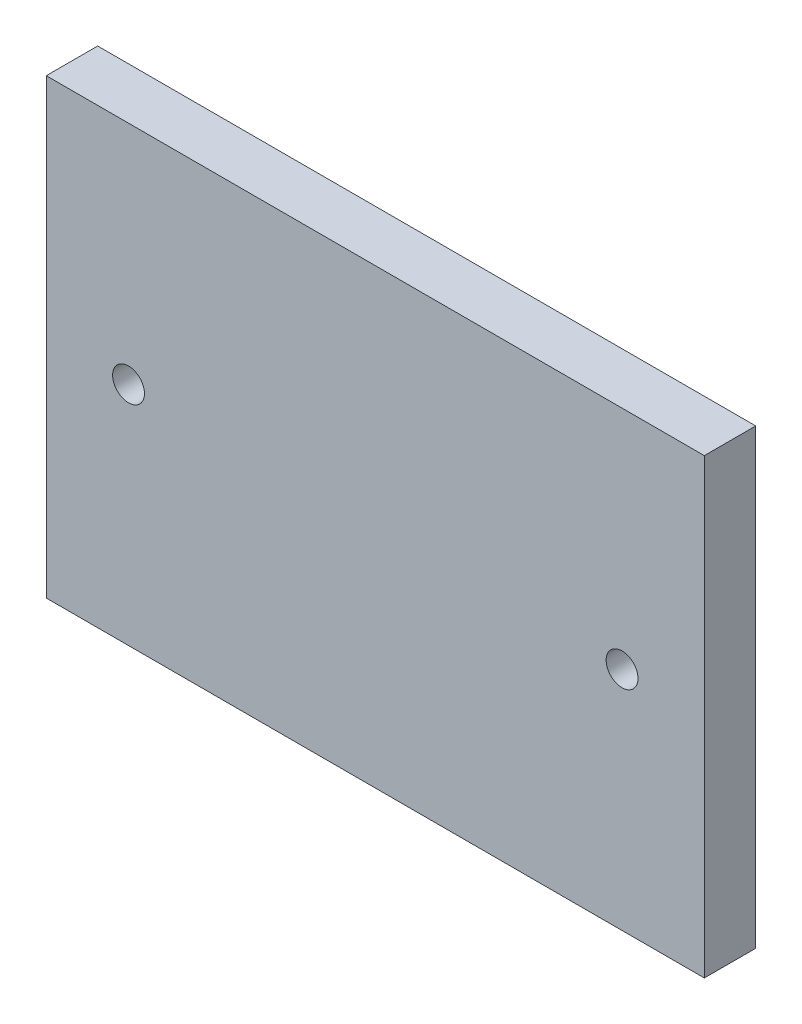
ISO-10303-21;
HEADER;
FILE_DESCRIPTION(('STEP AP214'),'2;1');
FILE_NAME('part.step','',(''),(''),'','','');
FILE_SCHEMA(('AUTOMOTIVE_DESIGN { 1 0 10303 214 1 1 1 1 }'));
ENDSEC;
DATA;
#1=APPLICATION_CONTEXT('core data for automotive mechanical design processes');
#2=APPLICATION_PROTOCOL_DEFINITION('international standard','automotive_design',2000,#1);
#3=PRODUCT_CONTEXT('',#1,'mechanical');
#4=PRODUCT('Part','Part','',(#3));
#5=PRODUCT_RELATED_PRODUCT_CATEGORY('part','',(#4));
#6=PRODUCT_DEFINITION_FORMATION('','',#4);
#7=PRODUCT_DEFINITION_CONTEXT('part definition',#1,'design');
#8=PRODUCT_DEFINITION('design','',#6,#7);
#9=PRODUCT_DEFINITION_SHAPE('','',#8);
#10=(LENGTH_UNIT() NAMED_UNIT(*) SI_UNIT(.MILLI.,.METRE.));
#11=(NAMED_UNIT(*) PLANE_ANGLE_UNIT() SI_UNIT($,.RADIAN.));
#12=(NAMED_UNIT(*) SI_UNIT($,.STERADIAN.) SOLID_ANGLE_UNIT());
#13=UNCERTAINTY_MEASURE_WITH_UNIT(LENGTH_MEASURE(1.E-05),#10,'distance_accuracy_value','');
#14=(GEOMETRIC_REPRESENTATION_CONTEXT(3) GLOBAL_UNCERTAINTY_ASSIGNED_CONTEXT((#13)) GLOBAL_UNIT_ASSIGNED_CONTEXT((#10,
#11,#12)) REPRESENTATION_CONTEXT('',''));
#15=CARTESIAN_POINT('',(0.,0.,0.));
#16=DIRECTION('',(0.,0.,1.));
#17=DIRECTION('',(1.,0.,0.));
#18=AXIS2_PLACEMENT_3D('',#15,#16,#17);
#19=CARTESIAN_POINT('',(32.,-22.,32.));
#20=DIRECTION('',(-1.,0.,0.));
#21=DIRECTION('',(0.,0.,1.));
#22=AXIS2_PLACEMENT_3D('',#19,#20,#21);
#23=PLANE('',#22);
#24=DIRECTION('',(0.,1.,0.));
#25=VECTOR('',#24,1.);
#26=CARTESIAN_POINT('',(32.,-22.,27.));
#27=LINE('',#26,#25);
#28=CARTESIAN_POINT('',(32.,-22.,27.));
#29=VERTEX_POINT('',#28);
#30=CARTESIAN_POINT('',(32.,22.,27.));
#31=VERTEX_POINT('',#30);
#32=EDGE_CURVE('E98',#29,#31,#27,.T.);
#33=ORIENTED_EDGE('',*,*,#32,.T.);
#34=DIRECTION('',(0.,0.,-1.));
#35=VECTOR('',#34,1.);
#36=CARTESIAN_POINT('',(32.,22.,32.));
#37=LINE('',#36,#35);
#38=CARTESIAN_POINT('',(32.,22.,32.));
#39=VERTEX_POINT('',#38);
#40=EDGE_CURVE('E11',#39,#31,#37,.T.);
#41=ORIENTED_EDGE('',*,*,#40,.F.);
#42=DIRECTION('',(0.,1.,0.));
#43=VECTOR('',#42,1.);
#44=CARTESIAN_POINT('',(32.,-22.,32.));
#45=LINE('',#44,#43);
#46=CARTESIAN_POINT('',(32.,-22.,32.));
#47=VERTEX_POINT('',#46);
#48=EDGE_CURVE('E86',#47,#39,#45,.T.);
#49=ORIENTED_EDGE('',*,*,#48,.F.);
#50=DIRECTION('',(0.,0.,-1.));
#51=VECTOR('',#50,1.);
#52=CARTESIAN_POINT('',(32.,-22.,32.));
#53=LINE('',#52,#51);
#54=EDGE_CURVE('E94',#47,#29,#53,.T.);
#55=ORIENTED_EDGE('',*,*,#54,.T.);
#56=EDGE_LOOP('',(#33,#41,#49,#55));
#57=FACE_BOUND('',#56,.T.);
#58=ADVANCED_FACE('F35',(#57),#23,.F.);
#59=CARTESIAN_POINT('',(-32.,22.,32.));
#60=DIRECTION('',(0.,-1.,0.));
#61=DIRECTION('',(0.,0.,-1.));
#62=AXIS2_PLACEMENT_3D('',#59,#60,#61);
#63=PLANE('',#62);
#64=DIRECTION('',(-1.,0.,0.));
#65=VECTOR('',#64,1.);
#66=CARTESIAN_POINT('',(-32.,22.,27.));
#67=LINE('',#66,#65);
#68=CARTESIAN_POINT('',(-32.,22.,27.));
#69=VERTEX_POINT('',#68);
#70=EDGE_CURVE('E90',#31,#69,#67,.T.);
#71=ORIENTED_EDGE('',*,*,#70,.T.);
#72=DIRECTION('',(0.,0.,-1.));
#73=VECTOR('',#72,1.);
#74=CARTESIAN_POINT('',(-32.,22.,32.));
#75=LINE('',#74,#73);
#76=CARTESIAN_POINT('',(-32.,22.,32.));
#77=VERTEX_POINT('',#76);
#78=EDGE_CURVE('E43',#77,#69,#75,.T.);
#79=ORIENTED_EDGE('',*,*,#78,.F.);
#80=DIRECTION('',(-1.,0.,0.));
#81=VECTOR('',#80,1.);
#82=CARTESIAN_POINT('',(-32.,22.,32.));
#83=LINE('',#82,#81);
#84=EDGE_CURVE('E81',#39,#77,#83,.T.);
#85=ORIENTED_EDGE('',*,*,#84,.F.);
#86=ORIENTED_EDGE('',*,*,#40,.T.);
#87=EDGE_LOOP('',(#71,#79,#85,#86));
#88=FACE_BOUND('',#87,.T.);
#89=ADVANCED_FACE('F89',(#88),#63,.F.);
#90=CARTESIAN_POINT('',(-32.,-22.,32.));
#91=DIRECTION('',(1.,0.,0.));
#92=DIRECTION('',(0.,0.,-1.));
#93=AXIS2_PLACEMENT_3D('',#90,#91,#92);
#94=PLANE('',#93);
#95=DIRECTION('',(0.,-1.,0.));
#96=VECTOR('',#95,1.);
#97=CARTESIAN_POINT('',(-32.,-22.,27.));
#98=LINE('',#97,#96);
#99=CARTESIAN_POINT('',(-32.,-22.,27.));
#100=VERTEX_POINT('',#99);
#101=EDGE_CURVE('E68',#69,#100,#98,.T.);
#102=ORIENTED_EDGE('',*,*,#101,.T.);
#103=DIRECTION('',(0.,0.,-1.));
#104=VECTOR('',#103,1.);
#105=CARTESIAN_POINT('',(-32.,-22.,32.));
#106=LINE('',#105,#104);
#107=CARTESIAN_POINT('',(-32.,-22.,32.));
#108=VERTEX_POINT('',#107);
#109=EDGE_CURVE('E91',#108,#100,#106,.T.);
#110=ORIENTED_EDGE('',*,*,#109,.F.);
#111=DIRECTION('',(0.,-1.,0.));
#112=VECTOR('',#111,1.);
#113=CARTESIAN_POINT('',(-32.,-22.,32.));
#114=LINE('',#113,#112);
#115=EDGE_CURVE('E84',#77,#108,#114,.T.);
#116=ORIENTED_EDGE('',*,*,#115,.F.);
#117=ORIENTED_EDGE('',*,*,#78,.T.);
#118=EDGE_LOOP('',(#102,#110,#116,#117));
#119=FACE_BOUND('',#118,.T.);
#120=ADVANCED_FACE('F92',(#119),#94,.F.);
#121=CARTESIAN_POINT('',(-32.,-22.,32.));
#122=DIRECTION('',(0.,1.,0.));
#123=DIRECTION('',(0.,0.,1.));
#124=AXIS2_PLACEMENT_3D('',#121,#122,#123);
#125=PLANE('',#124);
#126=DIRECTION('',(1.,0.,0.));
#127=VECTOR('',#126,1.);
#128=CARTESIAN_POINT('',(-32.,-22.,27.));
#129=LINE('',#128,#127);
#130=EDGE_CURVE('E74',#100,#29,#129,.T.);
#131=ORIENTED_EDGE('',*,*,#130,.T.);
#132=ORIENTED_EDGE('',*,*,#54,.F.);
#133=DIRECTION('',(1.,0.,0.));
#134=VECTOR('',#133,1.);
#135=CARTESIAN_POINT('',(-32.,-22.,32.));
#136=LINE('',#135,#134);
#137=EDGE_CURVE('E51',#108,#47,#136,.T.);
#138=ORIENTED_EDGE('',*,*,#137,.F.);
#139=ORIENTED_EDGE('',*,*,#109,.T.);
#140=EDGE_LOOP('',(#131,#132,#138,#139));
#141=FACE_BOUND('',#140,.T.);
#142=ADVANCED_FACE('F106',(#141),#125,.F.);
#143=CARTESIAN_POINT('',(0.,0.,32.));
#144=DIRECTION('',(0.,0.,-1.));
#145=DIRECTION('',(-1.,0.,0.));
#146=AXIS2_PLACEMENT_3D('',#143,#144,#145);
#147=PLANE('',#146);
#148=CARTESIAN_POINT('',(-24.,0.,32.));
#149=DIRECTION('',(0.,0.,1.));
#150=DIRECTION('',(1.,0.,0.));
#151=AXIS2_PLACEMENT_3D('',#148,#149,#150);
#152=CIRCLE('',#151,1.55);
#153=CARTESIAN_POINT('',(-22.45,0.,32.));
#154=VERTEX_POINT('',#153);
#155=EDGE_CURVE('E101',#154,#154,#152,.T.);
#156=ORIENTED_EDGE('',*,*,#155,.F.);
#157=EDGE_LOOP('',(#156));
#158=FACE_BOUND('',#157,.T.);
#159=CARTESIAN_POINT('',(24.,0.,32.));
#160=DIRECTION('',(0.,0.,1.));
#161=DIRECTION('',(1.,0.,0.));
#162=AXIS2_PLACEMENT_3D('',#159,#160,#161);
#163=CIRCLE('',#162,1.55);
#164=CARTESIAN_POINT('',(25.55,0.,32.));
#165=VERTEX_POINT('',#164);
#166=EDGE_CURVE('E115',#165,#165,#163,.T.);
#167=ORIENTED_EDGE('',*,*,#166,.F.);
#168=EDGE_LOOP('',(#167));
#169=FACE_BOUND('',#168,.T.);
#170=ORIENTED_EDGE('',*,*,#48,.T.);
#171=ORIENTED_EDGE('',*,*,#84,.T.);
#172=ORIENTED_EDGE('',*,*,#115,.T.);
#173=ORIENTED_EDGE('',*,*,#137,.T.);
#174=EDGE_LOOP('',(#170,#171,#172,#173));
#175=FACE_BOUND('',#174,.T.);
#176=ADVANCED_FACE('F82',(#158,#169,#175),#147,.F.);
#177=CARTESIAN_POINT('',(0.,0.,27.));
#178=DIRECTION('',(0.,0.,-1.));
#179=DIRECTION('',(-1.,0.,0.));
#180=AXIS2_PLACEMENT_3D('',#177,#178,#179);
#181=PLANE('',#180);
#182=CARTESIAN_POINT('',(-24.,0.,27.));
#183=DIRECTION('',(0.,0.,1.));
#184=DIRECTION('',(1.,0.,0.));
#185=AXIS2_PLACEMENT_3D('',#182,#183,#184);
#186=CIRCLE('',#185,1.55);
#187=CARTESIAN_POINT('',(-22.45,0.,27.));
#188=VERTEX_POINT('',#187);
#189=EDGE_CURVE('E118',#188,#188,#186,.T.);
#190=ORIENTED_EDGE('',*,*,#189,.T.);
#191=EDGE_LOOP('',(#190));
#192=FACE_BOUND('',#191,.T.);
#193=CARTESIAN_POINT('',(24.,0.,27.));
#194=DIRECTION('',(0.,0.,1.));
#195=DIRECTION('',(1.,0.,0.));
#196=AXIS2_PLACEMENT_3D('',#193,#194,#195);
#197=CIRCLE('',#196,1.55);
#198=CARTESIAN_POINT('',(25.55,0.,27.));
#199=VERTEX_POINT('',#198);
#200=EDGE_CURVE('E112',#199,#199,#197,.T.);
#201=ORIENTED_EDGE('',*,*,#200,.T.);
#202=EDGE_LOOP('',(#201));
#203=FACE_BOUND('',#202,.T.);
#204=ORIENTED_EDGE('',*,*,#32,.F.);
#205=ORIENTED_EDGE('',*,*,#130,.F.);
#206=ORIENTED_EDGE('',*,*,#101,.F.);
#207=ORIENTED_EDGE('',*,*,#70,.F.);
#208=EDGE_LOOP('',(#204,#205,#206,#207));
#209=FACE_BOUND('',#208,.T.);
#210=ADVANCED_FACE('F109',(#192,#203,#209),#181,.T.);
#211=CARTESIAN_POINT('',(24.,0.,32.));
#212=DIRECTION('',(0.,0.,-1.));
#213=DIRECTION('',(-1.,0.,0.));
#214=AXIS2_PLACEMENT_3D('',#211,#212,#213);
#215=CYLINDRICAL_SURFACE('',#214,1.55);
#216=ORIENTED_EDGE('',*,*,#166,.T.);
#217=EDGE_LOOP('',(#216));
#218=FACE_BOUND('',#217,.T.);
#219=ORIENTED_EDGE('',*,*,#200,.F.);
#220=EDGE_LOOP('',(#219));
#221=FACE_BOUND('',#220,.T.);
#222=ADVANCED_FACE('F132',(#218,#221),#215,.F.);
#223=CARTESIAN_POINT('',(-24.,0.,32.));
#224=DIRECTION('',(0.,0.,-1.));
#225=DIRECTION('',(-1.,0.,0.));
#226=AXIS2_PLACEMENT_3D('',#223,#224,#225);
#227=CYLINDRICAL_SURFACE('',#226,1.55);
#228=ORIENTED_EDGE('',*,*,#155,.T.);
#229=EDGE_LOOP('',(#228));
#230=FACE_BOUND('',#229,.T.);
#231=ORIENTED_EDGE('',*,*,#189,.F.);
#232=EDGE_LOOP('',(#231));
#233=FACE_BOUND('',#232,.T.);
#234=ADVANCED_FACE('F124',(#230,#233),#227,.F.);
#235=CLOSED_SHELL('',(#58,#89,#120,#142,#176,#210,#222,#234));
#236=MANIFOLD_SOLID_BREP('B2',#235);
#237=ADVANCED_BREP_SHAPE_REPRESENTATION('',(#18,#236),#14);
#238=SHAPE_DEFINITION_REPRESENTATION(#9,#237);
ENDSEC;
END-ISO-10303-21;
